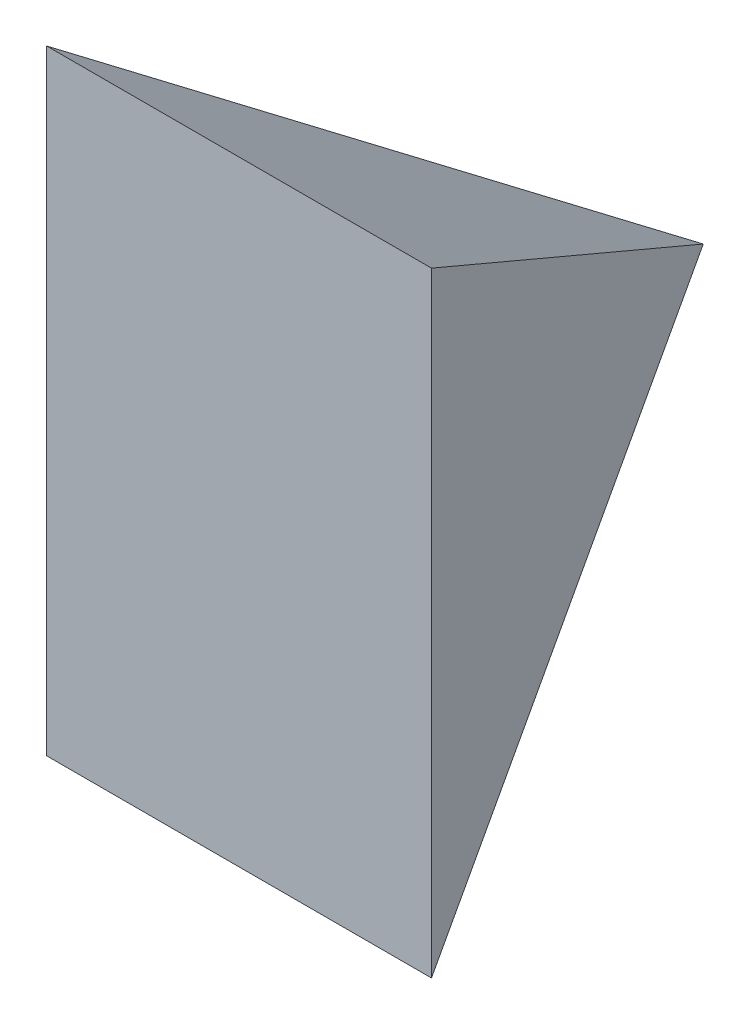
ISO-10303-21;
HEADER;
FILE_DESCRIPTION(('STEP AP214'),'2;1');
FILE_NAME('part.step','',(''),(''),'','','');
FILE_SCHEMA(('AUTOMOTIVE_DESIGN { 1 0 10303 214 1 1 1 1 }'));
ENDSEC;
DATA;
#1=APPLICATION_CONTEXT('core data for automotive mechanical design processes');
#2=APPLICATION_PROTOCOL_DEFINITION('international standard','automotive_design',2000,#1);
#3=PRODUCT_CONTEXT('',#1,'mechanical');
#4=PRODUCT('Part','Part','',(#3));
#5=PRODUCT_RELATED_PRODUCT_CATEGORY('part','',(#4));
#6=PRODUCT_DEFINITION_FORMATION('','',#4);
#7=PRODUCT_DEFINITION_CONTEXT('part definition',#1,'design');
#8=PRODUCT_DEFINITION('design','',#6,#7);
#9=PRODUCT_DEFINITION_SHAPE('','',#8);
#10=(LENGTH_UNIT() NAMED_UNIT(*) SI_UNIT(.MILLI.,.METRE.));
#11=(NAMED_UNIT(*) PLANE_ANGLE_UNIT() SI_UNIT($,.RADIAN.));
#12=(NAMED_UNIT(*) SI_UNIT($,.STERADIAN.) SOLID_ANGLE_UNIT());
#13=UNCERTAINTY_MEASURE_WITH_UNIT(LENGTH_MEASURE(1.E-05),#10,'distance_accuracy_value','');
#14=(GEOMETRIC_REPRESENTATION_CONTEXT(3) GLOBAL_UNCERTAINTY_ASSIGNED_CONTEXT((#13)) GLOBAL_UNIT_ASSIGNED_CONTEXT((#10,
#11,#12)) REPRESENTATION_CONTEXT('',''));
#15=CARTESIAN_POINT('',(0.,0.,0.));
#16=DIRECTION('',(0.,0.,1.));
#17=DIRECTION('',(1.,0.,0.));
#18=AXIS2_PLACEMENT_3D('',#15,#16,#17);
#19=CARTESIAN_POINT('',(0.,0.,450.));
#20=DIRECTION('',(0.,0.,1.));
#21=DIRECTION('',(1.,0.,0.));
#22=AXIS2_PLACEMENT_3D('',#19,#20,#21);
#23=PLANE('',#22);
#24=DIRECTION('',(0.,1.,0.));
#25=VECTOR('',#24,1.);
#26=CARTESIAN_POINT('',(186.5,298.,450.));
#27=LINE('',#26,#25);
#28=CARTESIAN_POINT('',(186.5,-298.,450.));
#29=VERTEX_POINT('',#28);
#30=CARTESIAN_POINT('',(186.5,298.,450.));
#31=VERTEX_POINT('',#30);
#32=EDGE_CURVE('E94',#29,#31,#27,.T.);
#33=ORIENTED_EDGE('',*,*,#32,.T.);
#34=DIRECTION('',(-1.,0.,0.));
#35=VECTOR('',#34,1.);
#36=CARTESIAN_POINT('',(-186.5,298.,450.));
#37=LINE('',#36,#35);
#38=CARTESIAN_POINT('',(-186.5,298.,450.));
#39=VERTEX_POINT('',#38);
#40=EDGE_CURVE('E12',#31,#39,#37,.T.);
#41=ORIENTED_EDGE('',*,*,#40,.T.);
#42=DIRECTION('',(0.,-1.,0.));
#43=VECTOR('',#42,1.);
#44=CARTESIAN_POINT('',(-186.5,298.,450.));
#45=LINE('',#44,#43);
#46=CARTESIAN_POINT('',(-186.5,-298.,450.));
#47=VERTEX_POINT('',#46);
#48=EDGE_CURVE('E53',#39,#47,#45,.T.);
#49=ORIENTED_EDGE('',*,*,#48,.T.);
#50=DIRECTION('',(1.,0.,0.));
#51=VECTOR('',#50,1.);
#52=CARTESIAN_POINT('',(-186.5,-298.,450.));
#53=LINE('',#52,#51);
#54=EDGE_CURVE('E81',#47,#29,#53,.T.);
#55=ORIENTED_EDGE('',*,*,#54,.T.);
#56=EDGE_LOOP('',(#33,#41,#49,#55));
#57=FACE_BOUND('',#56,.T.);
#58=ADVANCED_FACE('F40',(#57),#23,.T.);
#59=CARTESIAN_POINT('',(0.,0.,0.));
#60=DIRECTION('',(0.,-0.833756609425853,0.552132154686453));
#61=DIRECTION('',(0.,-0.552132154686453,-0.833756609425853));
#62=AXIS2_PLACEMENT_3D('',#59,#60,#61);
#63=PLANE('',#62);
#64=DIRECTION('',(-0.326597302156486,0.521855206662911,0.788036385900369));
#65=VECTOR('',#64,1.);
#66=CARTESIAN_POINT('',(0.,0.,0.));
#67=LINE('',#66,#65);
#68=CARTESIAN_POINT('',(0.,0.,0.));
#69=VERTEX_POINT('',#68);
#70=EDGE_CURVE('E84',#69,#39,#67,.T.);
#71=ORIENTED_EDGE('',*,*,#70,.T.);
#72=ORIENTED_EDGE('',*,*,#40,.F.);
#73=DIRECTION('',(0.326597302156486,0.521855206662911,0.788036385900369));
#74=VECTOR('',#73,1.);
#75=CARTESIAN_POINT('',(0.,0.,0.));
#76=LINE('',#75,#74);
#77=EDGE_CURVE('E61',#69,#31,#76,.T.);
#78=ORIENTED_EDGE('',*,*,#77,.F.);
#79=EDGE_LOOP('',(#71,#72,#78));
#80=FACE_BOUND('',#79,.T.);
#81=ADVANCED_FACE('F91',(#80),#63,.F.);
#82=CARTESIAN_POINT('',(0.,0.,0.));
#83=DIRECTION('',(0.923804105240165,0.,-0.382865479171757));
#84=DIRECTION('',(-0.382865479171757,0.,-0.923804105240165));
#85=AXIS2_PLACEMENT_3D('',#82,#83,#84);
#86=PLANE('',#85);
#87=ORIENTED_EDGE('',*,*,#77,.T.);
#88=ORIENTED_EDGE('',*,*,#32,.F.);
#89=DIRECTION('',(0.326597302156486,-0.521855206662911,0.788036385900369));
#90=VECTOR('',#89,1.);
#91=CARTESIAN_POINT('',(0.,0.,0.));
#92=LINE('',#91,#90);
#93=EDGE_CURVE('E80',#69,#29,#92,.T.);
#94=ORIENTED_EDGE('',*,*,#93,.F.);
#95=EDGE_LOOP('',(#87,#88,#94));
#96=FACE_BOUND('',#95,.T.);
#97=ADVANCED_FACE('F96',(#96),#86,.T.);
#98=CARTESIAN_POINT('',(0.,0.,0.));
#99=DIRECTION('',(-0.923804105240164,0.,-0.382865479171757));
#100=DIRECTION('',(-0.382865479171757,0.,0.923804105240165));
#101=AXIS2_PLACEMENT_3D('',#98,#99,#100);
#102=PLANE('',#101);
#103=DIRECTION('',(-0.326597302156486,-0.521855206662911,0.788036385900369));
#104=VECTOR('',#103,1.);
#105=CARTESIAN_POINT('',(0.,0.,0.));
#106=LINE('',#105,#104);
#107=EDGE_CURVE('E78',#69,#47,#106,.T.);
#108=ORIENTED_EDGE('',*,*,#107,.T.);
#109=ORIENTED_EDGE('',*,*,#48,.F.);
#110=ORIENTED_EDGE('',*,*,#70,.F.);
#111=EDGE_LOOP('',(#108,#109,#110));
#112=FACE_BOUND('',#111,.T.);
#113=ADVANCED_FACE('F87',(#112),#102,.T.);
#114=CARTESIAN_POINT('',(0.,0.,0.));
#115=DIRECTION('',(0.,0.833756609425853,0.552132154686454));
#116=DIRECTION('',(0.,-0.552132154686454,0.833756609425853));
#117=AXIS2_PLACEMENT_3D('',#114,#115,#116);
#118=PLANE('',#117);
#119=ORIENTED_EDGE('',*,*,#93,.T.);
#120=ORIENTED_EDGE('',*,*,#54,.F.);
#121=ORIENTED_EDGE('',*,*,#107,.F.);
#122=EDGE_LOOP('',(#119,#120,#121));
#123=FACE_BOUND('',#122,.T.);
#124=ADVANCED_FACE('F42',(#123),#118,.F.);
#125=CLOSED_SHELL('',(#58,#81,#97,#113,#124));
#126=MANIFOLD_SOLID_BREP('B2',#125);
#127=ADVANCED_BREP_SHAPE_REPRESENTATION('',(#18,#126),#14);
#128=SHAPE_DEFINITION_REPRESENTATION(#9,#127);
ENDSEC;
END-ISO-10303-21;
